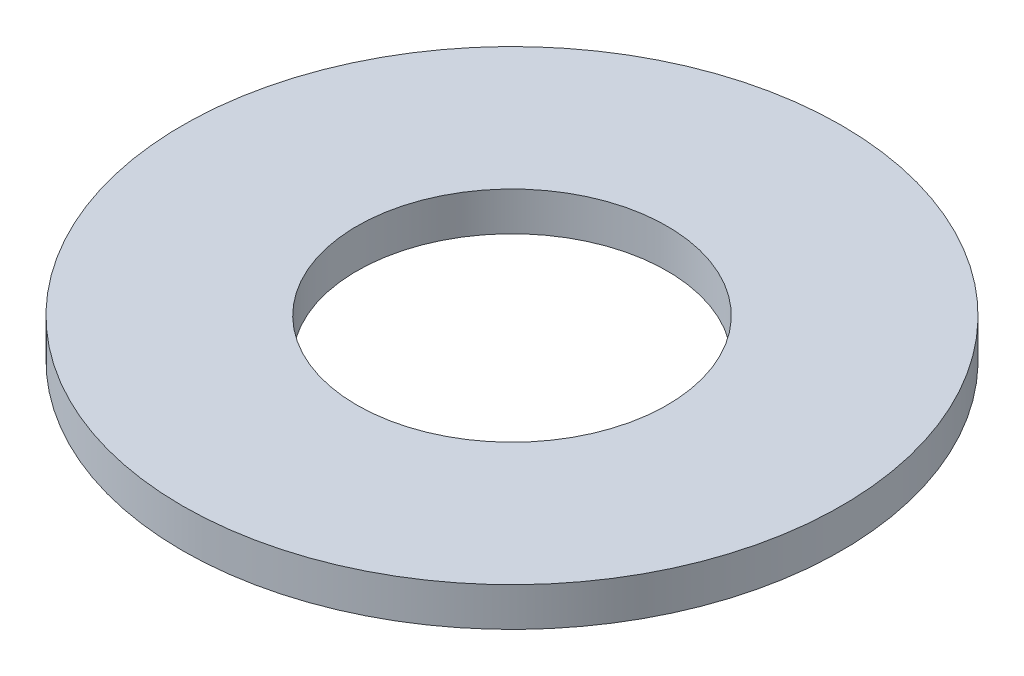
ISO-10303-21;
HEADER;
FILE_DESCRIPTION(('STEP AP214'),'2;1');
FILE_NAME('part.step','',(''),(''),'','','');
FILE_SCHEMA(('AUTOMOTIVE_DESIGN { 1 0 10303 214 1 1 1 1 }'));
ENDSEC;
DATA;
#1=APPLICATION_CONTEXT('core data for automotive mechanical design processes');
#2=APPLICATION_PROTOCOL_DEFINITION('international standard','automotive_design',2000,#1);
#3=PRODUCT_CONTEXT('',#1,'mechanical');
#4=PRODUCT('Part','Part','',(#3));
#5=PRODUCT_RELATED_PRODUCT_CATEGORY('part','',(#4));
#6=PRODUCT_DEFINITION_FORMATION('','',#4);
#7=PRODUCT_DEFINITION_CONTEXT('part definition',#1,'design');
#8=PRODUCT_DEFINITION('design','',#6,#7);
#9=PRODUCT_DEFINITION_SHAPE('','',#8);
#10=(LENGTH_UNIT() NAMED_UNIT(*) SI_UNIT(.MILLI.,.METRE.));
#11=(NAMED_UNIT(*) PLANE_ANGLE_UNIT() SI_UNIT($,.RADIAN.));
#12=(NAMED_UNIT(*) SI_UNIT($,.STERADIAN.) SOLID_ANGLE_UNIT());
#13=UNCERTAINTY_MEASURE_WITH_UNIT(LENGTH_MEASURE(1.E-05),#10,'distance_accuracy_value','');
#14=(GEOMETRIC_REPRESENTATION_CONTEXT(3) GLOBAL_UNCERTAINTY_ASSIGNED_CONTEXT((#13)) GLOBAL_UNIT_ASSIGNED_CONTEXT((#10,
#11,#12)) REPRESENTATION_CONTEXT('',''));
#15=CARTESIAN_POINT('',(0.,0.,0.));
#16=DIRECTION('',(0.,0.,1.));
#17=DIRECTION('',(1.,0.,0.));
#18=AXIS2_PLACEMENT_3D('',#15,#16,#17);
#19=CARTESIAN_POINT('',(0.,2.,0.));
#20=DIRECTION('',(0.,1.,0.));
#21=DIRECTION('',(0.,0.,1.));
#22=AXIS2_PLACEMENT_3D('',#19,#20,#21);
#23=PLANE('',#22);
#24=CARTESIAN_POINT('',(0.,2.,0.));
#25=DIRECTION('',(0.,1.,0.));
#26=DIRECTION('',(0.,0.,1.));
#27=AXIS2_PLACEMENT_3D('',#24,#25,#26);
#28=CIRCLE('',#27,17.);
#29=CARTESIAN_POINT('',(0.,2.,17.));
#30=VERTEX_POINT('',#29);
#31=EDGE_CURVE('E10',#30,#30,#28,.T.);
#32=ORIENTED_EDGE('',*,*,#31,.T.);
#33=EDGE_LOOP('',(#32));
#34=FACE_BOUND('',#33,.T.);
#35=CARTESIAN_POINT('',(0.,2.,0.));
#36=DIRECTION('',(0.,1.,0.));
#37=DIRECTION('',(0.,0.,1.));
#38=AXIS2_PLACEMENT_3D('',#35,#36,#37);
#39=CIRCLE('',#38,8.);
#40=CARTESIAN_POINT('',(0.,2.,8.));
#41=VERTEX_POINT('',#40);
#42=EDGE_CURVE('E56',#41,#41,#39,.T.);
#43=ORIENTED_EDGE('',*,*,#42,.F.);
#44=EDGE_LOOP('',(#43));
#45=FACE_BOUND('',#44,.T.);
#46=ADVANCED_FACE('F43',(#34,#45),#23,.T.);
#47=CARTESIAN_POINT('',(0.,0.,0.));
#48=DIRECTION('',(0.,1.,0.));
#49=DIRECTION('',(0.,0.,1.));
#50=AXIS2_PLACEMENT_3D('',#47,#48,#49);
#51=PLANE('',#50);
#52=CARTESIAN_POINT('',(0.,0.,0.));
#53=DIRECTION('',(0.,1.,0.));
#54=DIRECTION('',(0.,0.,1.));
#55=AXIS2_PLACEMENT_3D('',#52,#53,#54);
#56=CIRCLE('',#55,17.);
#57=CARTESIAN_POINT('',(0.,0.,17.));
#58=VERTEX_POINT('',#57);
#59=EDGE_CURVE('E47',#58,#58,#56,.T.);
#60=ORIENTED_EDGE('',*,*,#59,.F.);
#61=EDGE_LOOP('',(#60));
#62=FACE_BOUND('',#61,.T.);
#63=CARTESIAN_POINT('',(0.,0.,0.));
#64=DIRECTION('',(0.,1.,0.));
#65=DIRECTION('',(0.,0.,1.));
#66=AXIS2_PLACEMENT_3D('',#63,#64,#65);
#67=CIRCLE('',#66,8.);
#68=CARTESIAN_POINT('',(0.,0.,8.));
#69=VERTEX_POINT('',#68);
#70=EDGE_CURVE('E58',#69,#69,#67,.T.);
#71=ORIENTED_EDGE('',*,*,#70,.T.);
#72=EDGE_LOOP('',(#71));
#73=FACE_BOUND('',#72,.T.);
#74=ADVANCED_FACE('F70',(#62,#73),#51,.F.);
#75=CARTESIAN_POINT('',(0.,2.,0.));
#76=DIRECTION('',(0.,-1.,0.));
#77=DIRECTION('',(0.,0.,-1.));
#78=AXIS2_PLACEMENT_3D('',#75,#76,#77);
#79=CYLINDRICAL_SURFACE('',#78,17.);
#80=ORIENTED_EDGE('',*,*,#31,.F.);
#81=EDGE_LOOP('',(#80));
#82=FACE_BOUND('',#81,.T.);
#83=ORIENTED_EDGE('',*,*,#59,.T.);
#84=EDGE_LOOP('',(#83));
#85=FACE_BOUND('',#84,.T.);
#86=ADVANCED_FACE('F45',(#82,#85),#79,.T.);
#87=CARTESIAN_POINT('',(0.,2.,0.));
#88=DIRECTION('',(0.,-1.,0.));
#89=DIRECTION('',(0.,0.,-1.));
#90=AXIS2_PLACEMENT_3D('',#87,#88,#89);
#91=CYLINDRICAL_SURFACE('',#90,8.);
#92=ORIENTED_EDGE('',*,*,#42,.T.);
#93=EDGE_LOOP('',(#92));
#94=FACE_BOUND('',#93,.T.);
#95=ORIENTED_EDGE('',*,*,#70,.F.);
#96=EDGE_LOOP('',(#95));
#97=FACE_BOUND('',#96,.T.);
#98=ADVANCED_FACE('F66',(#94,#97),#91,.F.);
#99=CLOSED_SHELL('',(#46,#74,#86,#98));
#100=MANIFOLD_SOLID_BREP('B2',#99);
#101=ADVANCED_BREP_SHAPE_REPRESENTATION('',(#18,#100),#14);
#102=SHAPE_DEFINITION_REPRESENTATION(#9,#101);
ENDSEC;
END-ISO-10303-21;
